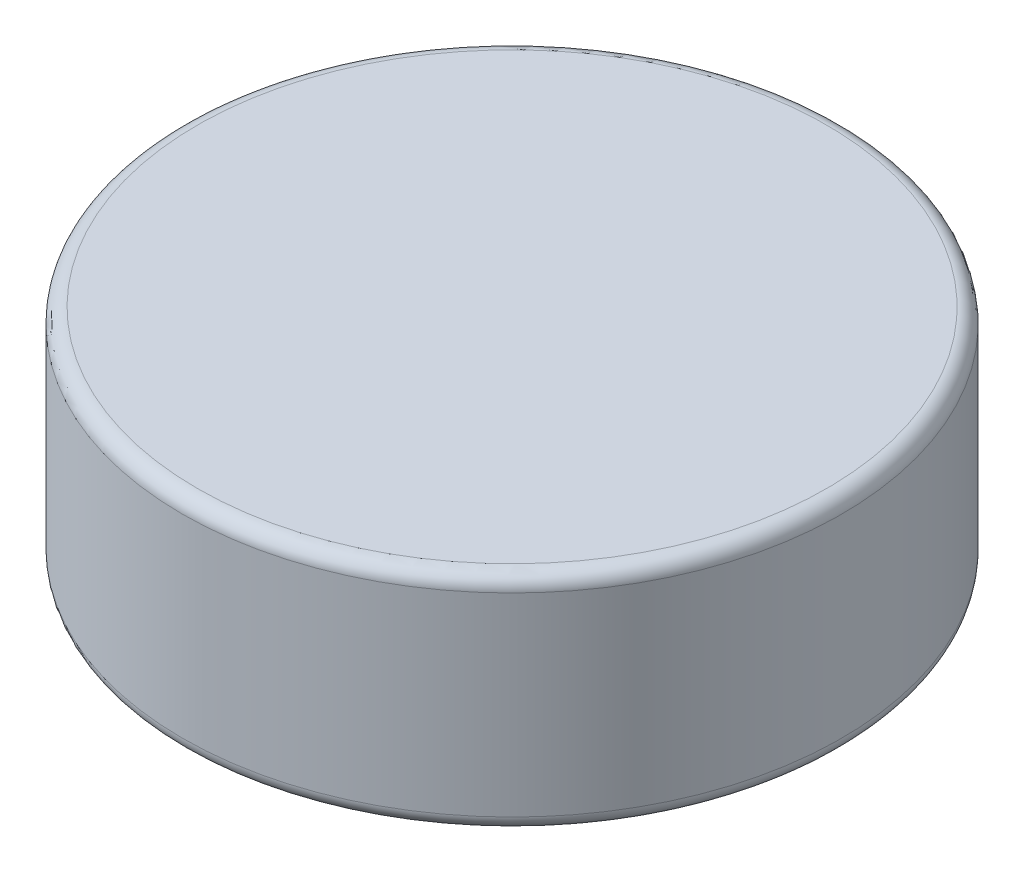
ISO-10303-21;
HEADER;
FILE_DESCRIPTION(('STEP AP214'),'2;1');
FILE_NAME('part.step','',(''),(''),'','','');
FILE_SCHEMA(('AUTOMOTIVE_DESIGN { 1 0 10303 214 1 1 1 1 }'));
ENDSEC;
DATA;
#1=APPLICATION_CONTEXT('core data for automotive mechanical design processes');
#2=APPLICATION_PROTOCOL_DEFINITION('international standard','automotive_design',2000,#1);
#3=PRODUCT_CONTEXT('',#1,'mechanical');
#4=PRODUCT('Part','Part','',(#3));
#5=PRODUCT_RELATED_PRODUCT_CATEGORY('part','',(#4));
#6=PRODUCT_DEFINITION_FORMATION('','',#4);
#7=PRODUCT_DEFINITION_CONTEXT('part definition',#1,'design');
#8=PRODUCT_DEFINITION('design','',#6,#7);
#9=PRODUCT_DEFINITION_SHAPE('','',#8);
#10=(LENGTH_UNIT() NAMED_UNIT(*) SI_UNIT(.MILLI.,.METRE.));
#11=(NAMED_UNIT(*) PLANE_ANGLE_UNIT() SI_UNIT($,.RADIAN.));
#12=(NAMED_UNIT(*) SI_UNIT($,.STERADIAN.) SOLID_ANGLE_UNIT());
#13=UNCERTAINTY_MEASURE_WITH_UNIT(LENGTH_MEASURE(1.E-05),#10,'distance_accuracy_value','');
#14=(GEOMETRIC_REPRESENTATION_CONTEXT(3) GLOBAL_UNCERTAINTY_ASSIGNED_CONTEXT((#13)) GLOBAL_UNIT_ASSIGNED_CONTEXT((#10,
#11,#12)) REPRESENTATION_CONTEXT('',''));
#15=CARTESIAN_POINT('',(0.,0.,0.));
#16=DIRECTION('',(0.,0.,1.));
#17=DIRECTION('',(1.,0.,0.));
#18=AXIS2_PLACEMENT_3D('',#15,#16,#17);
#19=CARTESIAN_POINT('',(0.,15.0622,0.));
#20=DIRECTION('',(0.,-1.,0.));
#21=DIRECTION('',(0.,0.,-1.));
#22=AXIS2_PLACEMENT_3D('',#19,#20,#21);
#23=CYLINDRICAL_SURFACE('',#22,22.1869);
#24=CARTESIAN_POINT('',(0.,0.999999999999999,0.));
#25=DIRECTION('',(0.,1.,0.));
#26=DIRECTION('',(0.,0.,1.));
#27=AXIS2_PLACEMENT_3D('',#24,#25,#26);
#28=CIRCLE('',#27,22.1869);
#29=CARTESIAN_POINT('',(0.,0.999999999999999,22.1869));
#30=VERTEX_POINT('',#29);
#31=EDGE_CURVE('E44',#30,#30,#28,.T.);
#32=ORIENTED_EDGE('',*,*,#31,.T.);
#33=EDGE_LOOP('',(#32));
#34=FACE_BOUND('',#33,.T.);
#35=CARTESIAN_POINT('',(0.,14.0622,0.));
#36=DIRECTION('',(0.,1.,0.));
#37=DIRECTION('',(0.,0.,1.));
#38=AXIS2_PLACEMENT_3D('',#35,#36,#37);
#39=CIRCLE('',#38,22.1869);
#40=CARTESIAN_POINT('',(0.,14.0622,22.1869));
#41=VERTEX_POINT('',#40);
#42=EDGE_CURVE('E48',#41,#41,#39,.F.);
#43=ORIENTED_EDGE('',*,*,#42,.T.);
#44=EDGE_LOOP('',(#43));
#45=FACE_BOUND('',#44,.T.);
#46=ADVANCED_FACE('F33',(#34,#45),#23,.T.);
#47=CARTESIAN_POINT('',(0.,15.0622,0.));
#48=DIRECTION('',(0.,1.,0.));
#49=DIRECTION('',(0.,0.,1.));
#50=AXIS2_PLACEMENT_3D('',#47,#48,#49);
#51=PLANE('',#50);
#52=CARTESIAN_POINT('',(0.,15.0622,0.));
#53=DIRECTION('',(0.,1.,0.));
#54=DIRECTION('',(0.,0.,1.));
#55=AXIS2_PLACEMENT_3D('',#52,#53,#54);
#56=CIRCLE('',#55,21.1869);
#57=CARTESIAN_POINT('',(0.,15.0622,21.1869));
#58=VERTEX_POINT('',#57);
#59=EDGE_CURVE('E10',#58,#58,#56,.T.);
#60=ORIENTED_EDGE('',*,*,#59,.T.);
#61=EDGE_LOOP('',(#60));
#62=FACE_BOUND('',#61,.T.);
#63=ADVANCED_FACE('F64',(#62),#51,.T.);
#64=CARTESIAN_POINT('',(0.,0.,0.));
#65=DIRECTION('',(0.,1.,0.));
#66=DIRECTION('',(0.,0.,1.));
#67=AXIS2_PLACEMENT_3D('',#64,#65,#66);
#68=PLANE('',#67);
#69=CARTESIAN_POINT('',(0.,0.,0.));
#70=DIRECTION('',(0.,1.,0.));
#71=DIRECTION('',(0.,0.,1.));
#72=AXIS2_PLACEMENT_3D('',#69,#70,#71);
#73=CIRCLE('',#72,21.1869);
#74=CARTESIAN_POINT('',(0.,0.,21.1869));
#75=VERTEX_POINT('',#74);
#76=EDGE_CURVE('E40',#75,#75,#73,.F.);
#77=ORIENTED_EDGE('',*,*,#76,.T.);
#78=EDGE_LOOP('',(#77));
#79=FACE_BOUND('',#78,.T.);
#80=ADVANCED_FACE('F61',(#79),#68,.F.);
#81=CARTESIAN_POINT('',(0.,0.999999999999999,0.));
#82=DIRECTION('',(0.,1.,0.));
#83=DIRECTION('',(0.,0.,1.));
#84=AXIS2_PLACEMENT_3D('',#81,#82,#83);
#85=TOROIDAL_SURFACE('',#84,21.1869,1.);
#86=ORIENTED_EDGE('',*,*,#76,.F.);
#87=EDGE_LOOP('',(#86));
#88=FACE_BOUND('',#87,.T.);
#89=ORIENTED_EDGE('',*,*,#31,.F.);
#90=EDGE_LOOP('',(#89));
#91=FACE_BOUND('',#90,.T.);
#92=ADVANCED_FACE('F57',(#88,#91),#85,.T.);
#93=CARTESIAN_POINT('',(0.,14.0622,0.));
#94=DIRECTION('',(0.,1.,0.));
#95=DIRECTION('',(0.,0.,1.));
#96=AXIS2_PLACEMENT_3D('',#93,#94,#95);
#97=TOROIDAL_SURFACE('',#96,21.1869,1.);
#98=ORIENTED_EDGE('',*,*,#42,.F.);
#99=EDGE_LOOP('',(#98));
#100=FACE_BOUND('',#99,.T.);
#101=ORIENTED_EDGE('',*,*,#59,.F.);
#102=EDGE_LOOP('',(#101));
#103=FACE_BOUND('',#102,.T.);
#104=ADVANCED_FACE('F35',(#100,#103),#97,.T.);
#105=CLOSED_SHELL('',(#46,#63,#80,#92,#104));
#106=MANIFOLD_SOLID_BREP('B2',#105);
#107=ADVANCED_BREP_SHAPE_REPRESENTATION('',(#18,#106),#14);
#108=SHAPE_DEFINITION_REPRESENTATION(#9,#107);
ENDSEC;
END-ISO-10303-21;
